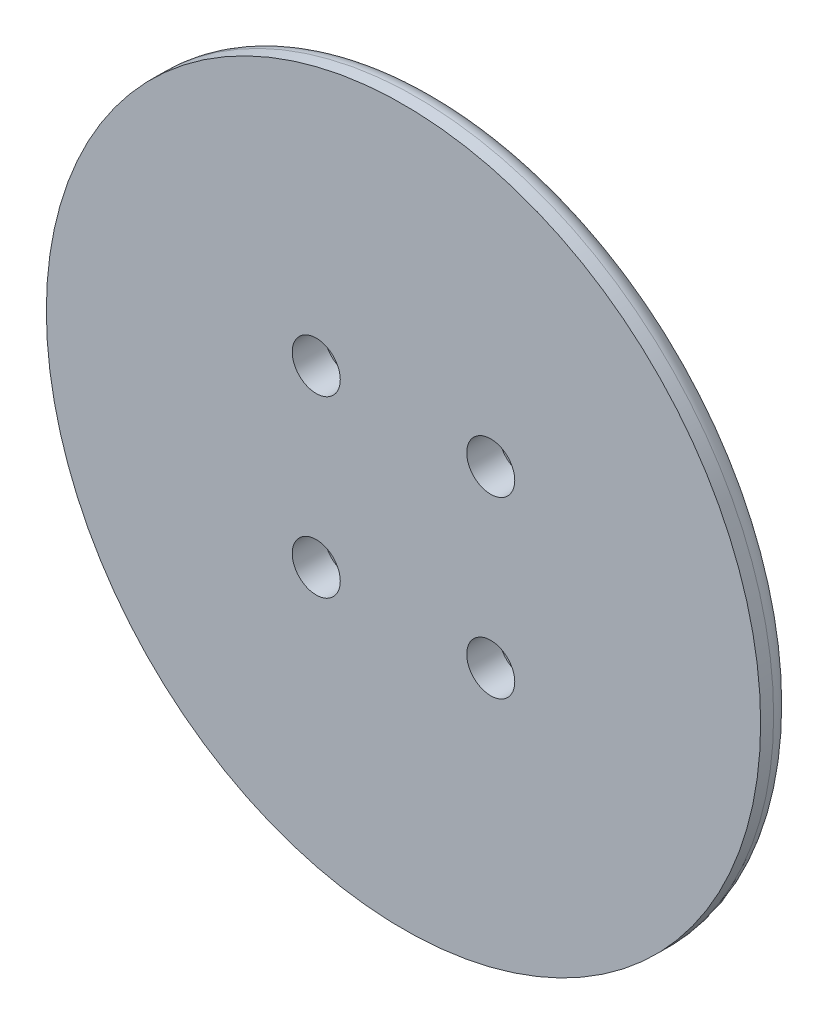
ISO-10303-21;
HEADER;
FILE_DESCRIPTION(('STEP AP214'),'2;1');
FILE_NAME('part.step','',(''),(''),'','','');
FILE_SCHEMA(('AUTOMOTIVE_DESIGN { 1 0 10303 214 1 1 1 1 }'));
ENDSEC;
DATA;
#1=APPLICATION_CONTEXT('core data for automotive mechanical design processes');
#2=APPLICATION_PROTOCOL_DEFINITION('international standard','automotive_design',2000,#1);
#3=PRODUCT_CONTEXT('',#1,'mechanical');
#4=PRODUCT('Part','Part','',(#3));
#5=PRODUCT_RELATED_PRODUCT_CATEGORY('part','',(#4));
#6=PRODUCT_DEFINITION_FORMATION('','',#4);
#7=PRODUCT_DEFINITION_CONTEXT('part definition',#1,'design');
#8=PRODUCT_DEFINITION('design','',#6,#7);
#9=PRODUCT_DEFINITION_SHAPE('','',#8);
#10=(LENGTH_UNIT() NAMED_UNIT(*) SI_UNIT(.MILLI.,.METRE.));
#11=(NAMED_UNIT(*) PLANE_ANGLE_UNIT() SI_UNIT($,.RADIAN.));
#12=(NAMED_UNIT(*) SI_UNIT($,.STERADIAN.) SOLID_ANGLE_UNIT());
#13=UNCERTAINTY_MEASURE_WITH_UNIT(LENGTH_MEASURE(1.E-05),#10,'distance_accuracy_value','');
#14=(GEOMETRIC_REPRESENTATION_CONTEXT(3) GLOBAL_UNCERTAINTY_ASSIGNED_CONTEXT((#13)) GLOBAL_UNIT_ASSIGNED_CONTEXT((#10,
#11,#12)) REPRESENTATION_CONTEXT('',''));
#15=CARTESIAN_POINT('',(0.,0.,0.));
#16=DIRECTION('',(0.,0.,1.));
#17=DIRECTION('',(1.,0.,0.));
#18=AXIS2_PLACEMENT_3D('',#15,#16,#17);
#19=CARTESIAN_POINT('',(0.,0.,5.));
#20=DIRECTION('',(0.,0.,1.));
#21=DIRECTION('',(1.,0.,0.));
#22=AXIS2_PLACEMENT_3D('',#19,#20,#21);
#23=PLANE('',#22);
#24=CARTESIAN_POINT('',(13.4350288425442,-13.4350288425446,5.));
#25=DIRECTION('',(0.,0.,1.));
#26=DIRECTION('',(1.,0.,0.));
#27=AXIS2_PLACEMENT_3D('',#24,#25,#26);
#28=CIRCLE('',#27,1.7);
#29=CARTESIAN_POINT('',(15.1350288425442,-13.4350288425446,5.));
#30=VERTEX_POINT('',#29);
#31=EDGE_CURVE('E86',#30,#30,#28,.T.);
#32=ORIENTED_EDGE('',*,*,#31,.F.);
#33=EDGE_LOOP('',(#32));
#34=FACE_BOUND('',#33,.T.);
#35=CARTESIAN_POINT('',(13.4350288425442,-13.4350288425446,5.));
#36=DIRECTION('',(0.,0.,1.));
#37=DIRECTION('',(1.,0.,0.));
#38=AXIS2_PLACEMENT_3D('',#35,#36,#37);
#39=CIRCLE('',#38,3.7);
#40=CARTESIAN_POINT('',(17.1350288425442,-13.4350288425446,5.));
#41=VERTEX_POINT('',#40);
#42=EDGE_CURVE('E109',#41,#41,#39,.T.);
#43=ORIENTED_EDGE('',*,*,#42,.T.);
#44=EDGE_LOOP('',(#43));
#45=FACE_BOUND('',#44,.T.);
#46=ADVANCED_FACE('F43',(#34,#45),#23,.T.);
#47=CARTESIAN_POINT('',(-13.4350288425443,13.4350288425445,5.));
#48=DIRECTION('',(0.,0.,1.));
#49=DIRECTION('',(1.,0.,0.));
#50=AXIS2_PLACEMENT_3D('',#47,#48,#49);
#51=CIRCLE('',#50,1.7);
#52=CARTESIAN_POINT('',(-11.7350288425443,13.4350288425445,5.));
#53=VERTEX_POINT('',#52);
#54=EDGE_CURVE('E74',#53,#53,#51,.T.);
#55=ORIENTED_EDGE('',*,*,#54,.F.);
#56=EDGE_LOOP('',(#55));
#57=FACE_BOUND('',#56,.T.);
#58=CARTESIAN_POINT('',(-13.4350288425443,13.4350288425445,5.));
#59=DIRECTION('',(0.,0.,1.));
#60=DIRECTION('',(1.,0.,0.));
#61=AXIS2_PLACEMENT_3D('',#58,#59,#60);
#62=CIRCLE('',#61,3.7);
#63=CARTESIAN_POINT('',(-9.73502884254433,13.4350288425445,5.));
#64=VERTEX_POINT('',#63);
#65=EDGE_CURVE('E117',#64,#64,#62,.T.);
#66=ORIENTED_EDGE('',*,*,#65,.T.);
#67=EDGE_LOOP('',(#66));
#68=FACE_BOUND('',#67,.T.);
#69=ADVANCED_FACE('F160',(#57,#68),#23,.T.);
#70=CARTESIAN_POINT('',(-13.4350288425444,-13.4350288425444,5.));
#71=DIRECTION('',(0.,0.,1.));
#72=DIRECTION('',(1.,0.,0.));
#73=AXIS2_PLACEMENT_3D('',#70,#71,#72);
#74=CIRCLE('',#73,1.7);
#75=CARTESIAN_POINT('',(-11.7350288425444,-13.4350288425444,5.));
#76=VERTEX_POINT('',#75);
#77=EDGE_CURVE('E79',#76,#76,#74,.T.);
#78=ORIENTED_EDGE('',*,*,#77,.F.);
#79=EDGE_LOOP('',(#78));
#80=FACE_BOUND('',#79,.T.);
#81=CARTESIAN_POINT('',(-13.4350288425444,-13.4350288425444,5.));
#82=DIRECTION('',(0.,0.,1.));
#83=DIRECTION('',(1.,0.,0.));
#84=AXIS2_PLACEMENT_3D('',#81,#82,#83);
#85=CIRCLE('',#84,3.7);
#86=CARTESIAN_POINT('',(-9.73502884254442,-13.4350288425444,5.));
#87=VERTEX_POINT('',#86);
#88=EDGE_CURVE('E124',#87,#87,#85,.T.);
#89=ORIENTED_EDGE('',*,*,#88,.T.);
#90=EDGE_LOOP('',(#89));
#91=FACE_BOUND('',#90,.T.);
#92=ADVANCED_FACE('F166',(#80,#91),#23,.T.);
#93=CARTESIAN_POINT('',(13.4350288425444,13.4350288425444,5.));
#94=DIRECTION('',(0.,0.,1.));
#95=DIRECTION('',(1.,0.,0.));
#96=AXIS2_PLACEMENT_3D('',#93,#94,#95);
#97=CIRCLE('',#96,1.7);
#98=CARTESIAN_POINT('',(15.1350288425444,13.4350288425444,5.));
#99=VERTEX_POINT('',#98);
#100=EDGE_CURVE('E94',#99,#99,#97,.T.);
#101=ORIENTED_EDGE('',*,*,#100,.F.);
#102=EDGE_LOOP('',(#101));
#103=FACE_BOUND('',#102,.T.);
#104=CARTESIAN_POINT('',(13.4350288425444,13.4350288425444,5.));
#105=DIRECTION('',(0.,0.,1.));
#106=DIRECTION('',(1.,0.,0.));
#107=AXIS2_PLACEMENT_3D('',#104,#105,#106);
#108=CIRCLE('',#107,3.7);
#109=CARTESIAN_POINT('',(17.1350288425444,13.4350288425444,5.));
#110=VERTEX_POINT('',#109);
#111=EDGE_CURVE('E132',#110,#110,#108,.T.);
#112=ORIENTED_EDGE('',*,*,#111,.T.);
#113=EDGE_LOOP('',(#112));
#114=FACE_BOUND('',#113,.T.);
#115=ADVANCED_FACE('F163',(#103,#114),#23,.T.);
#116=CARTESIAN_POINT('',(0.,0.,0.));
#117=DIRECTION('',(0.,0.,1.));
#118=DIRECTION('',(1.,0.,0.));
#119=AXIS2_PLACEMENT_3D('',#116,#117,#118);
#120=PLANE('',#119);
#121=CARTESIAN_POINT('',(0.,0.,0.));
#122=DIRECTION('',(0.,0.,1.));
#123=DIRECTION('',(1.,0.,0.));
#124=AXIS2_PLACEMENT_3D('',#121,#122,#123);
#125=CIRCLE('',#124,29.5);
#126=CARTESIAN_POINT('',(29.5,0.,0.));
#127=VERTEX_POINT('',#126);
#128=EDGE_CURVE('E58',#127,#127,#125,.F.);
#129=ORIENTED_EDGE('',*,*,#128,.T.);
#130=EDGE_LOOP('',(#129));
#131=FACE_BOUND('',#130,.T.);
#132=CARTESIAN_POINT('',(-13.4350288425443,13.4350288425445,0.));
#133=DIRECTION('',(0.,0.,1.));
#134=DIRECTION('',(1.,0.,0.));
#135=AXIS2_PLACEMENT_3D('',#132,#133,#134);
#136=CIRCLE('',#135,1.7);
#137=CARTESIAN_POINT('',(-11.7350288425443,13.4350288425445,0.));
#138=VERTEX_POINT('',#137);
#139=EDGE_CURVE('E75',#138,#138,#136,.T.);
#140=ORIENTED_EDGE('',*,*,#139,.T.);
#141=EDGE_LOOP('',(#140));
#142=FACE_BOUND('',#141,.T.);
#143=CARTESIAN_POINT('',(-13.4350288425444,-13.4350288425444,0.));
#144=DIRECTION('',(0.,0.,1.));
#145=DIRECTION('',(1.,0.,0.));
#146=AXIS2_PLACEMENT_3D('',#143,#144,#145);
#147=CIRCLE('',#146,1.7);
#148=CARTESIAN_POINT('',(-11.7350288425444,-13.4350288425444,0.));
#149=VERTEX_POINT('',#148);
#150=EDGE_CURVE('E83',#149,#149,#147,.T.);
#151=ORIENTED_EDGE('',*,*,#150,.T.);
#152=EDGE_LOOP('',(#151));
#153=FACE_BOUND('',#152,.T.);
#154=CARTESIAN_POINT('',(13.4350288425442,-13.4350288425446,0.));
#155=DIRECTION('',(0.,0.,1.));
#156=DIRECTION('',(1.,0.,0.));
#157=AXIS2_PLACEMENT_3D('',#154,#155,#156);
#158=CIRCLE('',#157,1.7);
#159=CARTESIAN_POINT('',(15.1350288425442,-13.4350288425446,0.));
#160=VERTEX_POINT('',#159);
#161=EDGE_CURVE('E90',#160,#160,#158,.T.);
#162=ORIENTED_EDGE('',*,*,#161,.T.);
#163=EDGE_LOOP('',(#162));
#164=FACE_BOUND('',#163,.T.);
#165=CARTESIAN_POINT('',(13.4350288425444,13.4350288425444,0.));
#166=DIRECTION('',(0.,0.,1.));
#167=DIRECTION('',(1.,0.,0.));
#168=AXIS2_PLACEMENT_3D('',#165,#166,#167);
#169=CIRCLE('',#168,1.7);
#170=CARTESIAN_POINT('',(15.1350288425444,13.4350288425444,0.));
#171=VERTEX_POINT('',#170);
#172=EDGE_CURVE('E98',#171,#171,#169,.T.);
#173=ORIENTED_EDGE('',*,*,#172,.T.);
#174=EDGE_LOOP('',(#173));
#175=FACE_BOUND('',#174,.T.);
#176=ADVANCED_FACE('F173',(#131,#142,#153,#164,#175),#120,.F.);
#177=CARTESIAN_POINT('',(0.,0.,5.));
#178=DIRECTION('',(0.,0.,-1.));
#179=DIRECTION('',(-1.,0.,0.));
#180=AXIS2_PLACEMENT_3D('',#177,#178,#179);
#181=CYLINDRICAL_SURFACE('',#180,32.5);
#182=CARTESIAN_POINT('',(0.,0.,3.));
#183=DIRECTION('',(0.,0.,1.));
#184=DIRECTION('',(1.,0.,0.));
#185=AXIS2_PLACEMENT_3D('',#182,#183,#184);
#186=CIRCLE('',#185,32.5);
#187=CARTESIAN_POINT('',(32.5,0.,3.));
#188=VERTEX_POINT('',#187);
#189=EDGE_CURVE('E65',#188,#188,#186,.T.);
#190=ORIENTED_EDGE('',*,*,#189,.T.);
#191=EDGE_LOOP('',(#190));
#192=FACE_BOUND('',#191,.T.);
#193=CARTESIAN_POINT('',(0.,0.,5.));
#194=DIRECTION('',(0.,0.,1.));
#195=DIRECTION('',(1.,0.,0.));
#196=AXIS2_PLACEMENT_3D('',#193,#194,#195);
#197=CIRCLE('',#196,32.5);
#198=CARTESIAN_POINT('',(32.5,0.,5.));
#199=VERTEX_POINT('',#198);
#200=EDGE_CURVE('E70',#199,#199,#197,.T.);
#201=ORIENTED_EDGE('',*,*,#200,.F.);
#202=EDGE_LOOP('',(#201));
#203=FACE_BOUND('',#202,.T.);
#204=ADVANCED_FACE('F178',(#192,#203),#181,.T.);
#205=CARTESIAN_POINT('',(-13.4350288425443,13.4350288425445,5.));
#206=DIRECTION('',(0.,0.,-1.));
#207=DIRECTION('',(-1.,0.,0.));
#208=AXIS2_PLACEMENT_3D('',#205,#206,#207);
#209=CYLINDRICAL_SURFACE('',#208,1.7);
#210=ORIENTED_EDGE('',*,*,#54,.T.);
#211=EDGE_LOOP('',(#210));
#212=FACE_BOUND('',#211,.T.);
#213=ORIENTED_EDGE('',*,*,#139,.F.);
#214=EDGE_LOOP('',(#213));
#215=FACE_BOUND('',#214,.T.);
#216=ADVANCED_FACE('F241',(#212,#215),#209,.F.);
#217=CARTESIAN_POINT('',(-13.4350288425444,-13.4350288425444,5.));
#218=DIRECTION('',(0.,0.,-1.));
#219=DIRECTION('',(-1.,0.,0.));
#220=AXIS2_PLACEMENT_3D('',#217,#218,#219);
#221=CYLINDRICAL_SURFACE('',#220,1.7);
#222=ORIENTED_EDGE('',*,*,#77,.T.);
#223=EDGE_LOOP('',(#222));
#224=FACE_BOUND('',#223,.T.);
#225=ORIENTED_EDGE('',*,*,#150,.F.);
#226=EDGE_LOOP('',(#225));
#227=FACE_BOUND('',#226,.T.);
#228=ADVANCED_FACE('F332',(#224,#227),#221,.F.);
#229=CARTESIAN_POINT('',(13.4350288425442,-13.4350288425446,5.));
#230=DIRECTION('',(0.,0.,-1.));
#231=DIRECTION('',(-1.,0.,0.));
#232=AXIS2_PLACEMENT_3D('',#229,#230,#231);
#233=CYLINDRICAL_SURFACE('',#232,1.7);
#234=ORIENTED_EDGE('',*,*,#31,.T.);
#235=EDGE_LOOP('',(#234));
#236=FACE_BOUND('',#235,.T.);
#237=ORIENTED_EDGE('',*,*,#161,.F.);
#238=EDGE_LOOP('',(#237));
#239=FACE_BOUND('',#238,.T.);
#240=ADVANCED_FACE('F323',(#236,#239),#233,.F.);
#241=CARTESIAN_POINT('',(13.4350288425444,13.4350288425444,5.));
#242=DIRECTION('',(0.,0.,-1.));
#243=DIRECTION('',(-1.,0.,0.));
#244=AXIS2_PLACEMENT_3D('',#241,#242,#243);
#245=CYLINDRICAL_SURFACE('',#244,1.7);
#246=ORIENTED_EDGE('',*,*,#100,.T.);
#247=EDGE_LOOP('',(#246));
#248=FACE_BOUND('',#247,.T.);
#249=ORIENTED_EDGE('',*,*,#172,.F.);
#250=EDGE_LOOP('',(#249));
#251=FACE_BOUND('',#250,.T.);
#252=ADVANCED_FACE('F154',(#248,#251),#245,.F.);
#253=CARTESIAN_POINT('',(0.,0.,5.));
#254=DIRECTION('',(0.,0.,1.));
#255=DIRECTION('',(1.,0.,0.));
#256=AXIS2_PLACEMENT_3D('',#253,#254,#255);
#257=PLANE('',#256);
#258=CARTESIAN_POINT('',(0.,0.,5.));
#259=DIRECTION('',(0.,0.,1.));
#260=DIRECTION('',(1.,0.,0.));
#261=AXIS2_PLACEMENT_3D('',#258,#259,#260);
#262=CIRCLE('',#261,52.);
#263=CARTESIAN_POINT('',(52.,0.,5.));
#264=VERTEX_POINT('',#263);
#265=EDGE_CURVE('E10',#264,#264,#262,.F.);
#266=ORIENTED_EDGE('',*,*,#265,.T.);
#267=EDGE_LOOP('',(#266));
#268=FACE_BOUND('',#267,.T.);
#269=ORIENTED_EDGE('',*,*,#200,.T.);
#270=EDGE_LOOP('',(#269));
#271=FACE_BOUND('',#270,.T.);
#272=ADVANCED_FACE('F146',(#268,#271),#257,.F.);
#273=CARTESIAN_POINT('',(0.,0.,10.));
#274=DIRECTION('',(0.,0.,1.));
#275=DIRECTION('',(1.,0.,0.));
#276=AXIS2_PLACEMENT_3D('',#273,#274,#275);
#277=PLANE('',#276);
#278=CARTESIAN_POINT('',(-13.4350288425444,-13.4350288425444,10.));
#279=DIRECTION('',(0.,0.,1.));
#280=DIRECTION('',(1.,0.,0.));
#281=AXIS2_PLACEMENT_3D('',#278,#279,#280);
#282=CIRCLE('',#281,3.7);
#283=CARTESIAN_POINT('',(-9.73502884254442,-13.4350288425444,10.));
#284=VERTEX_POINT('',#283);
#285=EDGE_CURVE('E121',#284,#284,#282,.T.);
#286=ORIENTED_EDGE('',*,*,#285,.F.);
#287=EDGE_LOOP('',(#286));
#288=FACE_BOUND('',#287,.T.);
#289=CARTESIAN_POINT('',(13.4350288425442,-13.4350288425446,10.));
#290=DIRECTION('',(0.,0.,1.));
#291=DIRECTION('',(1.,0.,0.));
#292=AXIS2_PLACEMENT_3D('',#289,#290,#291);
#293=CIRCLE('',#292,3.7);
#294=CARTESIAN_POINT('',(17.1350288425442,-13.4350288425446,10.));
#295=VERTEX_POINT('',#294);
#296=EDGE_CURVE('E108',#295,#295,#293,.T.);
#297=ORIENTED_EDGE('',*,*,#296,.F.);
#298=EDGE_LOOP('',(#297));
#299=FACE_BOUND('',#298,.T.);
#300=CARTESIAN_POINT('',(0.,0.,10.));
#301=DIRECTION('',(0.,0.,1.));
#302=DIRECTION('',(1.,0.,0.));
#303=AXIS2_PLACEMENT_3D('',#300,#301,#302);
#304=CIRCLE('',#303,55.);
#305=CARTESIAN_POINT('',(55.,0.,10.));
#306=VERTEX_POINT('',#305);
#307=EDGE_CURVE('E102',#306,#306,#304,.T.);
#308=ORIENTED_EDGE('',*,*,#307,.T.);
#309=EDGE_LOOP('',(#308));
#310=FACE_BOUND('',#309,.T.);
#311=CARTESIAN_POINT('',(-13.4350288425443,13.4350288425445,10.));
#312=DIRECTION('',(0.,0.,1.));
#313=DIRECTION('',(1.,0.,0.));
#314=AXIS2_PLACEMENT_3D('',#311,#312,#313);
#315=CIRCLE('',#314,3.7);
#316=CARTESIAN_POINT('',(-9.73502884254433,13.4350288425445,10.));
#317=VERTEX_POINT('',#316);
#318=EDGE_CURVE('E113',#317,#317,#315,.T.);
#319=ORIENTED_EDGE('',*,*,#318,.F.);
#320=EDGE_LOOP('',(#319));
#321=FACE_BOUND('',#320,.T.);
#322=CARTESIAN_POINT('',(13.4350288425444,13.4350288425444,10.));
#323=DIRECTION('',(0.,0.,1.));
#324=DIRECTION('',(1.,0.,0.));
#325=AXIS2_PLACEMENT_3D('',#322,#323,#324);
#326=CIRCLE('',#325,3.7);
#327=CARTESIAN_POINT('',(17.1350288425444,13.4350288425444,10.));
#328=VERTEX_POINT('',#327);
#329=EDGE_CURVE('E128',#328,#328,#326,.T.);
#330=ORIENTED_EDGE('',*,*,#329,.F.);
#331=EDGE_LOOP('',(#330));
#332=FACE_BOUND('',#331,.T.);
#333=ADVANCED_FACE('F143',(#288,#299,#310,#321,#332),#277,.T.);
#334=CARTESIAN_POINT('',(0.,0.,10.));
#335=DIRECTION('',(0.,0.,-1.));
#336=DIRECTION('',(-1.,0.,0.));
#337=AXIS2_PLACEMENT_3D('',#334,#335,#336);
#338=CYLINDRICAL_SURFACE('',#337,55.);
#339=CARTESIAN_POINT('',(0.,0.,8.));
#340=DIRECTION('',(0.,0.,1.));
#341=DIRECTION('',(1.,0.,0.));
#342=AXIS2_PLACEMENT_3D('',#339,#340,#341);
#343=CIRCLE('',#342,55.);
#344=CARTESIAN_POINT('',(55.,0.,8.));
#345=VERTEX_POINT('',#344);
#346=EDGE_CURVE('E51',#345,#345,#343,.T.);
#347=ORIENTED_EDGE('',*,*,#346,.T.);
#348=EDGE_LOOP('',(#347));
#349=FACE_BOUND('',#348,.T.);
#350=ORIENTED_EDGE('',*,*,#307,.F.);
#351=EDGE_LOOP('',(#350));
#352=FACE_BOUND('',#351,.T.);
#353=ADVANCED_FACE('F145',(#349,#352),#338,.T.);
#354=CARTESIAN_POINT('',(13.4350288425442,-13.4350288425446,10.));
#355=DIRECTION('',(0.,0.,-1.));
#356=DIRECTION('',(-1.,0.,0.));
#357=AXIS2_PLACEMENT_3D('',#354,#355,#356);
#358=CYLINDRICAL_SURFACE('',#357,3.7);
#359=ORIENTED_EDGE('',*,*,#296,.T.);
#360=EDGE_LOOP('',(#359));
#361=FACE_BOUND('',#360,.T.);
#362=ORIENTED_EDGE('',*,*,#42,.F.);
#363=EDGE_LOOP('',(#362));
#364=FACE_BOUND('',#363,.T.);
#365=ADVANCED_FACE('F152',(#361,#364),#358,.F.);
#366=CARTESIAN_POINT('',(-13.4350288425443,13.4350288425445,10.));
#367=DIRECTION('',(0.,0.,-1.));
#368=DIRECTION('',(-1.,0.,0.));
#369=AXIS2_PLACEMENT_3D('',#366,#367,#368);
#370=CYLINDRICAL_SURFACE('',#369,3.7);
#371=ORIENTED_EDGE('',*,*,#318,.T.);
#372=EDGE_LOOP('',(#371));
#373=FACE_BOUND('',#372,.T.);
#374=ORIENTED_EDGE('',*,*,#65,.F.);
#375=EDGE_LOOP('',(#374));
#376=FACE_BOUND('',#375,.T.);
#377=ADVANCED_FACE('F192',(#373,#376),#370,.F.);
#378=CARTESIAN_POINT('',(-13.4350288425444,-13.4350288425444,10.));
#379=DIRECTION('',(0.,0.,-1.));
#380=DIRECTION('',(-1.,0.,0.));
#381=AXIS2_PLACEMENT_3D('',#378,#379,#380);
#382=CYLINDRICAL_SURFACE('',#381,3.7);
#383=ORIENTED_EDGE('',*,*,#285,.T.);
#384=EDGE_LOOP('',(#383));
#385=FACE_BOUND('',#384,.T.);
#386=ORIENTED_EDGE('',*,*,#88,.F.);
#387=EDGE_LOOP('',(#386));
#388=FACE_BOUND('',#387,.T.);
#389=ADVANCED_FACE('F186',(#385,#388),#382,.F.);
#390=CARTESIAN_POINT('',(13.4350288425444,13.4350288425444,10.));
#391=DIRECTION('',(0.,0.,-1.));
#392=DIRECTION('',(-1.,0.,0.));
#393=AXIS2_PLACEMENT_3D('',#390,#391,#392);
#394=CYLINDRICAL_SURFACE('',#393,3.7);
#395=ORIENTED_EDGE('',*,*,#329,.T.);
#396=EDGE_LOOP('',(#395));
#397=FACE_BOUND('',#396,.T.);
#398=ORIENTED_EDGE('',*,*,#111,.F.);
#399=EDGE_LOOP('',(#398));
#400=FACE_BOUND('',#399,.T.);
#401=ADVANCED_FACE('F140',(#397,#400),#394,.F.);
#402=CARTESIAN_POINT('',(0.,0.,3.));
#403=DIRECTION('',(0.,0.,1.));
#404=DIRECTION('',(1.,0.,0.));
#405=AXIS2_PLACEMENT_3D('',#402,#403,#404);
#406=TOROIDAL_SURFACE('',#405,29.5,3.);
#407=ORIENTED_EDGE('',*,*,#128,.F.);
#408=EDGE_LOOP('',(#407));
#409=FACE_BOUND('',#408,.T.);
#410=ORIENTED_EDGE('',*,*,#189,.F.);
#411=EDGE_LOOP('',(#410));
#412=FACE_BOUND('',#411,.T.);
#413=ADVANCED_FACE('F185',(#409,#412),#406,.T.);
#414=CARTESIAN_POINT('',(0.,0.,8.));
#415=DIRECTION('',(0.,0.,1.));
#416=DIRECTION('',(1.,0.,0.));
#417=AXIS2_PLACEMENT_3D('',#414,#415,#416);
#418=TOROIDAL_SURFACE('',#417,52.,3.);
#419=ORIENTED_EDGE('',*,*,#265,.F.);
#420=EDGE_LOOP('',(#419));
#421=FACE_BOUND('',#420,.T.);
#422=ORIENTED_EDGE('',*,*,#346,.F.);
#423=EDGE_LOOP('',(#422));
#424=FACE_BOUND('',#423,.T.);
#425=ADVANCED_FACE('F45',(#421,#424),#418,.T.);
#426=CLOSED_SHELL('',(#46,#69,#92,#115,#176,#204,#216,#228,#240,#252,#272,#333,#353,#365,#377,
#389,#401,#413,#425));
#427=MANIFOLD_SOLID_BREP('B2',#426);
#428=ADVANCED_BREP_SHAPE_REPRESENTATION('',(#18,#427),#14);
#429=SHAPE_DEFINITION_REPRESENTATION(#9,#428);
ENDSEC;
END-ISO-10303-21;
